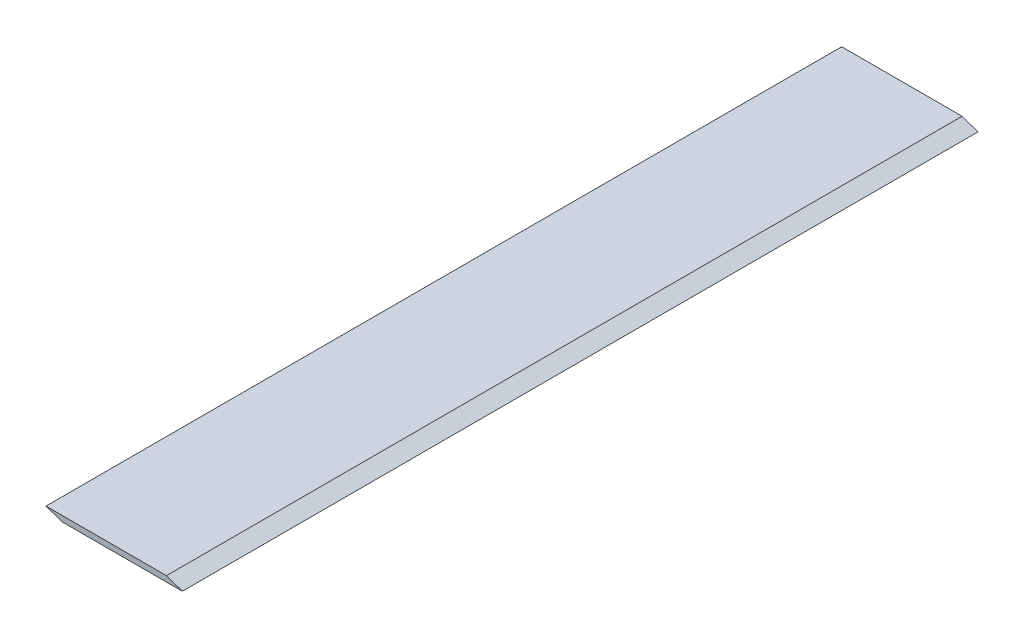
ISO-10303-21;
HEADER;
FILE_DESCRIPTION(('STEP AP214'),'2;1');
FILE_NAME('part.step','',(''),(''),'','','');
FILE_SCHEMA(('AUTOMOTIVE_DESIGN { 1 0 10303 214 1 1 1 1 }'));
ENDSEC;
DATA;
#1=APPLICATION_CONTEXT('core data for automotive mechanical design processes');
#2=APPLICATION_PROTOCOL_DEFINITION('international standard','automotive_design',2000,#1);
#3=PRODUCT_CONTEXT('',#1,'mechanical');
#4=PRODUCT('Part','Part','',(#3));
#5=PRODUCT_RELATED_PRODUCT_CATEGORY('part','',(#4));
#6=PRODUCT_DEFINITION_FORMATION('','',#4);
#7=PRODUCT_DEFINITION_CONTEXT('part definition',#1,'design');
#8=PRODUCT_DEFINITION('design','',#6,#7);
#9=PRODUCT_DEFINITION_SHAPE('','',#8);
#10=(LENGTH_UNIT() NAMED_UNIT(*) SI_UNIT(.MILLI.,.METRE.));
#11=(NAMED_UNIT(*) PLANE_ANGLE_UNIT() SI_UNIT($,.RADIAN.));
#12=(NAMED_UNIT(*) SI_UNIT($,.STERADIAN.) SOLID_ANGLE_UNIT());
#13=UNCERTAINTY_MEASURE_WITH_UNIT(LENGTH_MEASURE(1.E-05),#10,'distance_accuracy_value','');
#14=(GEOMETRIC_REPRESENTATION_CONTEXT(3) GLOBAL_UNCERTAINTY_ASSIGNED_CONTEXT((#13)) GLOBAL_UNIT_ASSIGNED_CONTEXT((#10,
#11,#12)) REPRESENTATION_CONTEXT('',''));
#15=CARTESIAN_POINT('',(0.,0.,0.));
#16=DIRECTION('',(0.,0.,1.));
#17=DIRECTION('',(1.,0.,0.));
#18=AXIS2_PLACEMENT_3D('',#15,#16,#17);
#19=CARTESIAN_POINT('',(0.,0.,195.));
#20=DIRECTION('',(0.,1.,0.));
#21=DIRECTION('',(0.,0.,1.));
#22=AXIS2_PLACEMENT_3D('',#19,#20,#21);
#23=PLANE('',#22);
#24=DIRECTION('',(1.,0.,0.));
#25=VECTOR('',#24,1.);
#26=CARTESIAN_POINT('',(0.,0.,195.));
#27=LINE('',#26,#25);
#28=CARTESIAN_POINT('',(6.86455707113063,0.,195.));
#29=VERTEX_POINT('',#28);
#30=CARTESIAN_POINT('',(22.,0.,195.));
#31=VERTEX_POINT('',#30);
#32=EDGE_CURVE('E85',#29,#31,#27,.T.);
#33=ORIENTED_EDGE('',*,*,#32,.F.);
#34=DIRECTION('',(0.,0.,-1.));
#35=VECTOR('',#34,1.);
#36=CARTESIAN_POINT('',(6.86455707113063,0.,195.));
#37=LINE('',#36,#35);
#38=CARTESIAN_POINT('',(6.86455707113063,0.,95.0000000000013));
#39=VERTEX_POINT('',#38);
#40=EDGE_CURVE('E74',#29,#39,#37,.T.);
#41=ORIENTED_EDGE('',*,*,#40,.T.);
#42=DIRECTION('',(-1.,0.,0.));
#43=VECTOR('',#42,1.);
#44=CARTESIAN_POINT('',(22.6607008494574,0.,95.0000000000013));
#45=LINE('',#44,#43);
#46=CARTESIAN_POINT('',(22.,0.,95.0000000000013));
#47=VERTEX_POINT('',#46);
#48=EDGE_CURVE('E106',#47,#39,#45,.T.);
#49=ORIENTED_EDGE('',*,*,#48,.F.);
#50=DIRECTION('',(0.,0.,-1.));
#51=VECTOR('',#50,1.);
#52=CARTESIAN_POINT('',(22.,0.,195.));
#53=LINE('',#52,#51);
#54=EDGE_CURVE('E11',#31,#47,#53,.T.);
#55=ORIENTED_EDGE('',*,*,#54,.F.);
#56=EDGE_LOOP('',(#33,#41,#49,#55));
#57=FACE_BOUND('',#56,.T.);
#58=ADVANCED_FACE('F35',(#57),#23,.F.);
#59=CARTESIAN_POINT('',(22.,0.,195.));
#60=DIRECTION('',(-0.330350424728106,-0.943858356366017,0.));
#61=DIRECTION('',(0.943858356366017,-0.330350424728106,0.));
#62=AXIS2_PLACEMENT_3D('',#59,#60,#61);
#63=PLANE('',#62);
#64=ORIENTED_EDGE('',*,*,#54,.T.);
#65=DIRECTION('',(-0.943858356366017,0.330350424728106,0.));
#66=VECTOR('',#65,1.);
#67=CARTESIAN_POINT('',(22.,0.,95.0000000000013));
#68=LINE('',#67,#66);
#69=CARTESIAN_POINT('',(20.,0.7,95.0000000000013));
#70=VERTEX_POINT('',#69);
#71=EDGE_CURVE('E90',#47,#70,#68,.T.);
#72=ORIENTED_EDGE('',*,*,#71,.T.);
#73=DIRECTION('',(0.,0.,-1.));
#74=VECTOR('',#73,1.);
#75=CARTESIAN_POINT('',(20.,0.700000000000002,195.));
#76=LINE('',#75,#74);
#77=CARTESIAN_POINT('',(20.,0.700000000000002,195.));
#78=VERTEX_POINT('',#77);
#79=EDGE_CURVE('E42',#78,#70,#76,.T.);
#80=ORIENTED_EDGE('',*,*,#79,.F.);
#81=DIRECTION('',(-0.943858356366017,0.330350424728106,0.));
#82=VECTOR('',#81,1.);
#83=CARTESIAN_POINT('',(22.,0.,195.));
#84=LINE('',#83,#82);
#85=EDGE_CURVE('E57',#31,#78,#84,.T.);
#86=ORIENTED_EDGE('',*,*,#85,.F.);
#87=EDGE_LOOP('',(#64,#72,#80,#86));
#88=FACE_BOUND('',#87,.T.);
#89=ADVANCED_FACE('F103',(#88),#63,.F.);
#90=CARTESIAN_POINT('',(20.,0.700000000000002,195.));
#91=DIRECTION('',(0.,-1.,0.));
#92=DIRECTION('',(1.,0.,0.));
#93=AXIS2_PLACEMENT_3D('',#90,#91,#92);
#94=PLANE('',#93);
#95=DIRECTION('',(-1.,0.,0.));
#96=VECTOR('',#95,1.);
#97=CARTESIAN_POINT('',(22.6607008494574,0.7,95.0000000000013));
#98=LINE('',#97,#96);
#99=CARTESIAN_POINT('',(4.86455707113063,0.7,95.0000000000013));
#100=VERTEX_POINT('',#99);
#101=EDGE_CURVE('E94',#70,#100,#98,.T.);
#102=ORIENTED_EDGE('',*,*,#101,.T.);
#103=DIRECTION('',(0.,0.,-1.));
#104=VECTOR('',#103,1.);
#105=CARTESIAN_POINT('',(4.86455707113064,0.699999999999999,195.));
#106=LINE('',#105,#104);
#107=CARTESIAN_POINT('',(4.86455707113064,0.699999999999999,195.));
#108=VERTEX_POINT('',#107);
#109=EDGE_CURVE('E49',#108,#100,#106,.T.);
#110=ORIENTED_EDGE('',*,*,#109,.F.);
#111=DIRECTION('',(-1.,0.,0.));
#112=VECTOR('',#111,1.);
#113=CARTESIAN_POINT('',(20.,0.700000000000002,195.));
#114=LINE('',#113,#112);
#115=EDGE_CURVE('E88',#78,#108,#114,.T.);
#116=ORIENTED_EDGE('',*,*,#115,.F.);
#117=ORIENTED_EDGE('',*,*,#79,.T.);
#118=EDGE_LOOP('',(#102,#110,#116,#117));
#119=FACE_BOUND('',#118,.T.);
#120=ADVANCED_FACE('F101',(#119),#94,.F.);
#121=CARTESIAN_POINT('',(0.,0.,195.));
#122=DIRECTION('',(0.,0.,1.));
#123=DIRECTION('',(1.,0.,0.));
#124=AXIS2_PLACEMENT_3D('',#121,#122,#123);
#125=PLANE('',#124);
#126=DIRECTION('',(0.943858356366017,-0.330350424728106,0.));
#127=VECTOR('',#126,1.);
#128=CARTESIAN_POINT('',(4.86455707113064,0.699999999999999,195.));
#129=LINE('',#128,#127);
#130=EDGE_CURVE('E77',#108,#29,#129,.T.);
#131=ORIENTED_EDGE('',*,*,#130,.T.);
#132=ORIENTED_EDGE('',*,*,#32,.T.);
#133=ORIENTED_EDGE('',*,*,#85,.T.);
#134=ORIENTED_EDGE('',*,*,#115,.T.);
#135=EDGE_LOOP('',(#131,#132,#133,#134));
#136=FACE_BOUND('',#135,.T.);
#137=ADVANCED_FACE('F84',(#136),#125,.T.);
#138=CARTESIAN_POINT('',(22.6607008494574,0.7,95.0000000000013));
#139=DIRECTION('',(0.,0.,1.));
#140=DIRECTION('',(1.,0.,0.));
#141=AXIS2_PLACEMENT_3D('',#138,#139,#140);
#142=PLANE('',#141);
#143=ORIENTED_EDGE('',*,*,#48,.T.);
#144=DIRECTION('',(0.943858356366017,-0.330350424728106,0.));
#145=VECTOR('',#144,1.);
#146=CARTESIAN_POINT('',(4.86455707113064,0.699999999999999,95.0000000000013));
#147=LINE('',#146,#145);
#148=EDGE_CURVE('E78',#100,#39,#147,.T.);
#149=ORIENTED_EDGE('',*,*,#148,.F.);
#150=ORIENTED_EDGE('',*,*,#101,.F.);
#151=ORIENTED_EDGE('',*,*,#71,.F.);
#152=EDGE_LOOP('',(#143,#149,#150,#151));
#153=FACE_BOUND('',#152,.T.);
#154=ADVANCED_FACE('F105',(#153),#142,.F.);
#155=CARTESIAN_POINT('',(4.86455707113064,0.699999999999999,195.));
#156=DIRECTION('',(0.330350424728106,0.943858356366017,0.));
#157=DIRECTION('',(-0.943858356366017,0.330350424728106,0.));
#158=AXIS2_PLACEMENT_3D('',#155,#156,#157);
#159=PLANE('',#158);
#160=ORIENTED_EDGE('',*,*,#148,.T.);
#161=ORIENTED_EDGE('',*,*,#40,.F.);
#162=ORIENTED_EDGE('',*,*,#130,.F.);
#163=ORIENTED_EDGE('',*,*,#109,.T.);
#164=EDGE_LOOP('',(#160,#161,#162,#163));
#165=FACE_BOUND('',#164,.T.);
#166=ADVANCED_FACE('F76',(#165),#159,.F.);
#167=CLOSED_SHELL('',(#58,#89,#120,#137,#154,#166));
#168=MANIFOLD_SOLID_BREP('B2',#167);
#169=ADVANCED_BREP_SHAPE_REPRESENTATION('',(#18,#168),#14);
#170=SHAPE_DEFINITION_REPRESENTATION(#9,#169);
ENDSEC;
END-ISO-10303-21;
